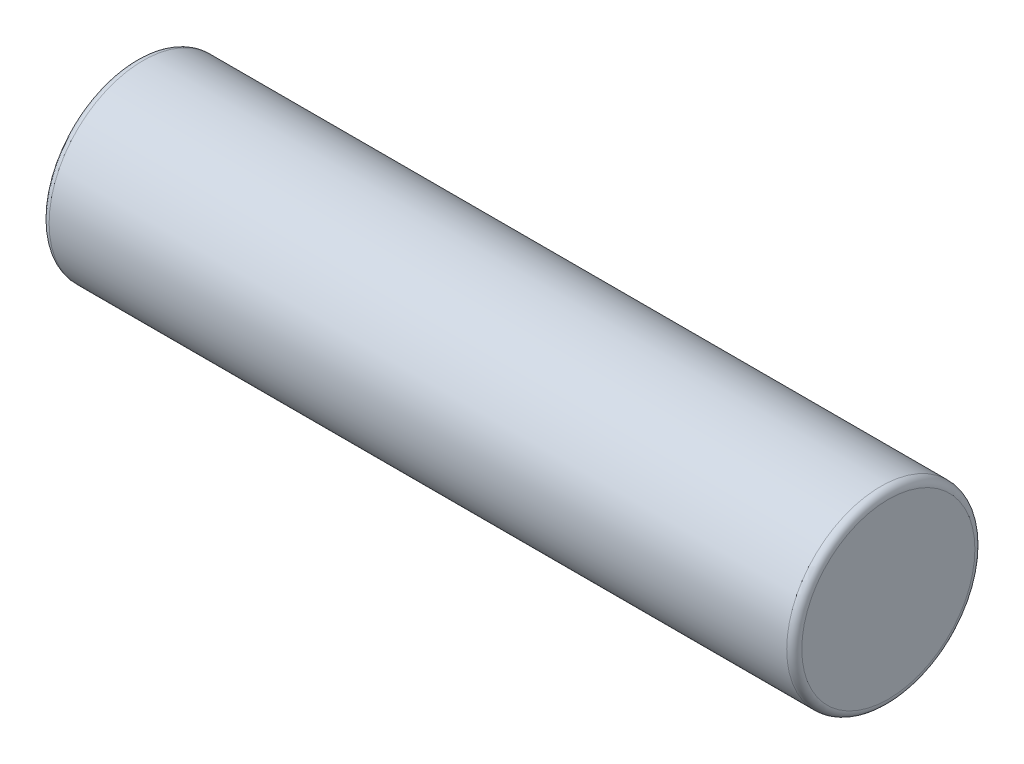
ISO-10303-21;
HEADER;
FILE_DESCRIPTION(('STEP AP214'),'2;1');
FILE_NAME('part.step','',(''),(''),'','','');
FILE_SCHEMA(('AUTOMOTIVE_DESIGN { 1 0 10303 214 1 1 1 1 }'));
ENDSEC;
DATA;
#1=APPLICATION_CONTEXT('core data for automotive mechanical design processes');
#2=APPLICATION_PROTOCOL_DEFINITION('international standard','automotive_design',2000,#1);
#3=PRODUCT_CONTEXT('',#1,'mechanical');
#4=PRODUCT('Part','Part','',(#3));
#5=PRODUCT_RELATED_PRODUCT_CATEGORY('part','',(#4));
#6=PRODUCT_DEFINITION_FORMATION('','',#4);
#7=PRODUCT_DEFINITION_CONTEXT('part definition',#1,'design');
#8=PRODUCT_DEFINITION('design','',#6,#7);
#9=PRODUCT_DEFINITION_SHAPE('','',#8);
#10=(LENGTH_UNIT() NAMED_UNIT(*) SI_UNIT(.MILLI.,.METRE.));
#11=(NAMED_UNIT(*) PLANE_ANGLE_UNIT() SI_UNIT($,.RADIAN.));
#12=(NAMED_UNIT(*) SI_UNIT($,.STERADIAN.) SOLID_ANGLE_UNIT());
#13=UNCERTAINTY_MEASURE_WITH_UNIT(LENGTH_MEASURE(1.E-05),#10,'distance_accuracy_value','');
#14=(GEOMETRIC_REPRESENTATION_CONTEXT(3) GLOBAL_UNCERTAINTY_ASSIGNED_CONTEXT((#13)) GLOBAL_UNIT_ASSIGNED_CONTEXT((#10,
#11,#12)) REPRESENTATION_CONTEXT('',''));
#15=CARTESIAN_POINT('',(0.,0.,0.));
#16=DIRECTION('',(0.,0.,1.));
#17=DIRECTION('',(1.,0.,0.));
#18=AXIS2_PLACEMENT_3D('',#15,#16,#17);
#19=CARTESIAN_POINT('',(25.4,0.,0.));
#20=DIRECTION('',(1.,0.,0.));
#21=DIRECTION('',(0.,0.,-1.));
#22=AXIS2_PLACEMENT_3D('',#19,#20,#21);
#23=PLANE('',#22);
#24=CARTESIAN_POINT('',(25.4,0.,0.));
#25=DIRECTION('',(-1.,0.,0.));
#26=DIRECTION('',(0.,0.,1.));
#27=AXIS2_PLACEMENT_3D('',#24,#25,#26);
#28=CIRCLE('',#27,2.921);
#29=CARTESIAN_POINT('',(25.4,0.,2.921));
#30=VERTEX_POINT('',#29);
#31=CARTESIAN_POINT('',(25.4,0.,-2.921));
#32=VERTEX_POINT('',#31);
#33=EDGE_CURVE('E49',#30,#32,#28,.T.);
#34=ORIENTED_EDGE('',*,*,#33,.F.);
#35=CARTESIAN_POINT('',(25.4,0.,0.));
#36=DIRECTION('',(-1.,0.,0.));
#37=DIRECTION('',(0.,0.,-1.));
#38=AXIS2_PLACEMENT_3D('',#35,#36,#37);
#39=CIRCLE('',#38,2.921);
#40=EDGE_CURVE('E45',#32,#30,#39,.T.);
#41=ORIENTED_EDGE('',*,*,#40,.F.);
#42=EDGE_LOOP('',(#34,#41));
#43=FACE_BOUND('',#42,.T.);
#44=ADVANCED_FACE('F16',(#43),#23,.T.);
#45=CARTESIAN_POINT('',(0.,0.,0.));
#46=DIRECTION('',(1.,0.,0.));
#47=DIRECTION('',(0.,0.,-1.));
#48=AXIS2_PLACEMENT_3D('',#45,#46,#47);
#49=PLANE('',#48);
#50=CARTESIAN_POINT('',(0.,0.,0.));
#51=DIRECTION('',(1.,0.,0.));
#52=DIRECTION('',(0.,0.,-1.));
#53=AXIS2_PLACEMENT_3D('',#50,#51,#52);
#54=CIRCLE('',#53,2.921);
#55=CARTESIAN_POINT('',(0.,0.,-2.921));
#56=VERTEX_POINT('',#55);
#57=CARTESIAN_POINT('',(0.,0.,2.921));
#58=VERTEX_POINT('',#57);
#59=EDGE_CURVE('E56',#56,#58,#54,.T.);
#60=ORIENTED_EDGE('',*,*,#59,.F.);
#61=CARTESIAN_POINT('',(0.,0.,0.));
#62=DIRECTION('',(1.,0.,0.));
#63=DIRECTION('',(0.,0.,1.));
#64=AXIS2_PLACEMENT_3D('',#61,#62,#63);
#65=CIRCLE('',#64,2.921);
#66=EDGE_CURVE('E36',#58,#56,#65,.T.);
#67=ORIENTED_EDGE('',*,*,#66,.F.);
#68=EDGE_LOOP('',(#60,#67));
#69=FACE_BOUND('',#68,.T.);
#70=ADVANCED_FACE('F74',(#69),#49,.F.);
#71=CARTESIAN_POINT('',(25.146,0.,0.));
#72=DIRECTION('',(1.,0.,0.));
#73=DIRECTION('',(0.,0.,-1.));
#74=AXIS2_PLACEMENT_3D('',#71,#72,#73);
#75=TOROIDAL_SURFACE('',#74,2.921,0.254);
#76=ORIENTED_EDGE('',*,*,#40,.T.);
#77=ORIENTED_EDGE('',*,*,#33,.T.);
#78=EDGE_LOOP('',(#76,#77));
#79=FACE_BOUND('',#78,.T.);
#80=CARTESIAN_POINT('',(25.146,0.,0.));
#81=DIRECTION('',(-1.,0.,0.));
#82=DIRECTION('',(0.,0.,1.));
#83=AXIS2_PLACEMENT_3D('',#80,#81,#82);
#84=CIRCLE('',#83,3.175);
#85=CARTESIAN_POINT('',(25.146,0.,3.175));
#86=VERTEX_POINT('',#85);
#87=EDGE_CURVE('E28',#86,#86,#84,.T.);
#88=ORIENTED_EDGE('',*,*,#87,.F.);
#89=EDGE_LOOP('',(#88));
#90=FACE_BOUND('',#89,.T.);
#91=ADVANCED_FACE('F54',(#79,#90),#75,.T.);
#92=CARTESIAN_POINT('',(0.254000000000001,0.,0.));
#93=DIRECTION('',(1.,0.,0.));
#94=DIRECTION('',(0.,0.,-1.));
#95=AXIS2_PLACEMENT_3D('',#92,#93,#94);
#96=TOROIDAL_SURFACE('',#95,2.921,0.254);
#97=CARTESIAN_POINT('',(0.254000000000001,0.,0.));
#98=DIRECTION('',(-1.,0.,0.));
#99=DIRECTION('',(0.,0.,1.));
#100=AXIS2_PLACEMENT_3D('',#97,#98,#99);
#101=CIRCLE('',#100,3.175);
#102=CARTESIAN_POINT('',(0.254000000000001,0.,3.175));
#103=VERTEX_POINT('',#102);
#104=EDGE_CURVE('E11',#103,#103,#101,.F.);
#105=ORIENTED_EDGE('',*,*,#104,.F.);
#106=EDGE_LOOP('',(#105));
#107=FACE_BOUND('',#106,.T.);
#108=ORIENTED_EDGE('',*,*,#59,.T.);
#109=ORIENTED_EDGE('',*,*,#66,.T.);
#110=EDGE_LOOP('',(#108,#109));
#111=FACE_BOUND('',#110,.T.);
#112=ADVANCED_FACE('F73',(#107,#111),#96,.T.);
#113=CARTESIAN_POINT('',(25.4,0.,0.));
#114=DIRECTION('',(-1.,0.,0.));
#115=DIRECTION('',(0.,0.,1.));
#116=AXIS2_PLACEMENT_3D('',#113,#114,#115);
#117=CYLINDRICAL_SURFACE('',#116,3.175);
#118=ORIENTED_EDGE('',*,*,#104,.T.);
#119=EDGE_LOOP('',(#118));
#120=FACE_BOUND('',#119,.T.);
#121=ORIENTED_EDGE('',*,*,#87,.T.);
#122=EDGE_LOOP('',(#121));
#123=FACE_BOUND('',#122,.T.);
#124=ADVANCED_FACE('F119',(#120,#123),#117,.T.);
#125=CLOSED_SHELL('',(#44,#70,#91,#112,#124));
#126=MANIFOLD_SOLID_BREP('B1',#125);
#127=ADVANCED_BREP_SHAPE_REPRESENTATION('',(#18,#126),#14);
#128=SHAPE_DEFINITION_REPRESENTATION(#9,#127);
ENDSEC;
END-ISO-10303-21;
